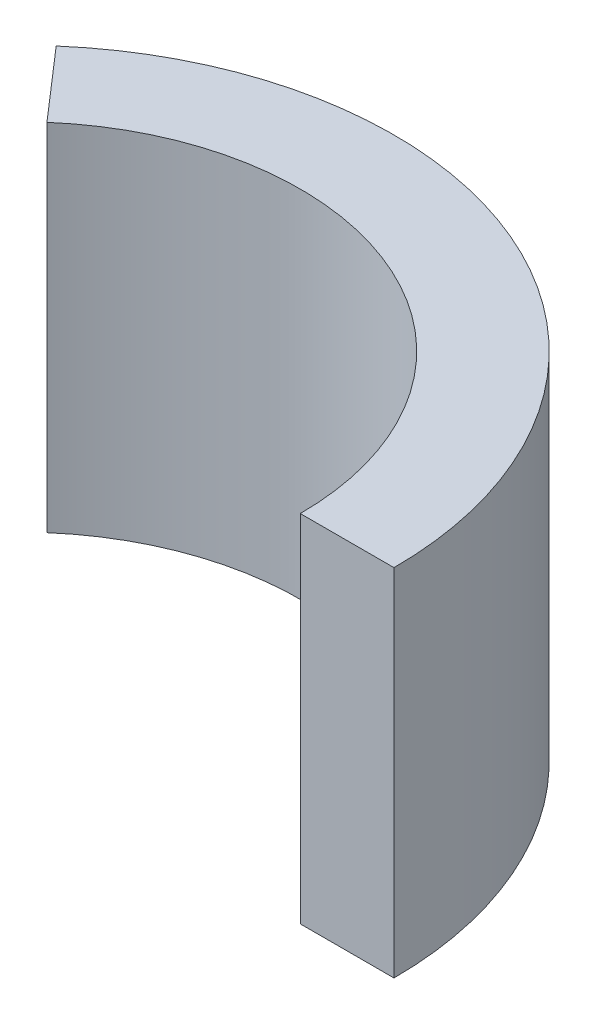
ISO-10303-21;
HEADER;
FILE_DESCRIPTION(('STEP AP214'),'2;1');
FILE_NAME('part.step','',(''),(''),'','','');
FILE_SCHEMA(('AUTOMOTIVE_DESIGN { 1 0 10303 214 1 1 1 1 }'));
ENDSEC;
DATA;
#1=APPLICATION_CONTEXT('core data for automotive mechanical design processes');
#2=APPLICATION_PROTOCOL_DEFINITION('international standard','automotive_design',2000,#1);
#3=PRODUCT_CONTEXT('',#1,'mechanical');
#4=PRODUCT('Part','Part','',(#3));
#5=PRODUCT_RELATED_PRODUCT_CATEGORY('part','',(#4));
#6=PRODUCT_DEFINITION_FORMATION('','',#4);
#7=PRODUCT_DEFINITION_CONTEXT('part definition',#1,'design');
#8=PRODUCT_DEFINITION('design','',#6,#7);
#9=PRODUCT_DEFINITION_SHAPE('','',#8);
#10=(LENGTH_UNIT() NAMED_UNIT(*) SI_UNIT(.MILLI.,.METRE.));
#11=(NAMED_UNIT(*) PLANE_ANGLE_UNIT() SI_UNIT($,.RADIAN.));
#12=(NAMED_UNIT(*) SI_UNIT($,.STERADIAN.) SOLID_ANGLE_UNIT());
#13=UNCERTAINTY_MEASURE_WITH_UNIT(LENGTH_MEASURE(1.E-05),#10,'distance_accuracy_value','');
#14=(GEOMETRIC_REPRESENTATION_CONTEXT(3) GLOBAL_UNCERTAINTY_ASSIGNED_CONTEXT((#13)) GLOBAL_UNIT_ASSIGNED_CONTEXT((#10,
#11,#12)) REPRESENTATION_CONTEXT('',''));
#15=CARTESIAN_POINT('',(0.,0.,0.));
#16=DIRECTION('',(0.,0.,1.));
#17=DIRECTION('',(1.,0.,0.));
#18=AXIS2_PLACEMENT_3D('',#15,#16,#17);
#19=CARTESIAN_POINT('',(4.,-13.,0.));
#20=DIRECTION('',(0.,-1.,0.));
#21=DIRECTION('',(0.,0.,-1.));
#22=AXIS2_PLACEMENT_3D('',#19,#20,#21);
#23=CYLINDRICAL_SURFACE('',#22,23.2);
#24=CARTESIAN_POINT('',(4.,-4.,0.));
#25=DIRECTION('',(0.,-1.,0.));
#26=DIRECTION('',(0.,0.,-1.));
#27=AXIS2_PLACEMENT_3D('',#24,#25,#26);
#28=CIRCLE('',#27,23.2);
#29=CARTESIAN_POINT('',(-11.2205694725798,-4.,-17.5092622611683));
#30=VERTEX_POINT('',#29);
#31=CARTESIAN_POINT('',(27.2,-4.,0.));
#32=VERTEX_POINT('',#31);
#33=EDGE_CURVE('E11',#30,#32,#28,.T.);
#34=ORIENTED_EDGE('',*,*,#33,.F.);
#35=DIRECTION('',(0.,1.,0.));
#36=VECTOR('',#35,1.);
#37=CARTESIAN_POINT('',(-11.2205694725798,-4.,-17.5092622611683));
#38=LINE('',#37,#36);
#39=CARTESIAN_POINT('',(-11.2205694725798,18.,-17.5092622611683));
#40=VERTEX_POINT('',#39);
#41=EDGE_CURVE('E87',#30,#40,#38,.T.);
#42=ORIENTED_EDGE('',*,*,#41,.T.);
#43=CARTESIAN_POINT('',(4.,18.,0.));
#44=DIRECTION('',(0.,-1.,0.));
#45=DIRECTION('',(0.,0.,-1.));
#46=AXIS2_PLACEMENT_3D('',#43,#44,#45);
#47=CIRCLE('',#46,23.2);
#48=CARTESIAN_POINT('',(27.2,18.,0.));
#49=VERTEX_POINT('',#48);
#50=EDGE_CURVE('E85',#40,#49,#47,.T.);
#51=ORIENTED_EDGE('',*,*,#50,.T.);
#52=DIRECTION('',(0.,1.,0.));
#53=VECTOR('',#52,1.);
#54=CARTESIAN_POINT('',(27.2,-4.,0.));
#55=LINE('',#54,#53);
#56=EDGE_CURVE('E84',#32,#49,#55,.T.);
#57=ORIENTED_EDGE('',*,*,#56,.F.);
#58=EDGE_LOOP('',(#34,#42,#51,#57));
#59=FACE_BOUND('',#58,.T.);
#60=ADVANCED_FACE('F44',(#59),#23,.T.);
#61=CARTESIAN_POINT('',(-11.2205694725798,-4.,-17.5092622611683));
#62=DIRECTION('',(0.,1.,0.));
#63=DIRECTION('',(0.,0.,1.));
#64=AXIS2_PLACEMENT_3D('',#61,#62,#63);
#65=PLANE('',#64);
#66=CARTESIAN_POINT('',(4.,-4.,0.));
#67=DIRECTION('',(0.,-1.,0.));
#68=DIRECTION('',(0.,0.,-1.));
#69=AXIS2_PLACEMENT_3D('',#66,#67,#68);
#70=CIRCLE('',#69,17.4);
#71=CARTESIAN_POINT('',(-7.41542710443482,-4.,-13.1319466958762));
#72=VERTEX_POINT('',#71);
#73=CARTESIAN_POINT('',(21.4,-4.,0.));
#74=VERTEX_POINT('',#73);
#75=EDGE_CURVE('E53',#72,#74,#70,.T.);
#76=ORIENTED_EDGE('',*,*,#75,.F.);
#77=DIRECTION('',(0.656059028990507,0.,0.754709580222772));
#78=VECTOR('',#77,1.);
#79=CARTESIAN_POINT('',(-11.2205694725798,-4.,-17.5092622611683));
#80=LINE('',#79,#78);
#81=EDGE_CURVE('E91',#30,#72,#80,.T.);
#82=ORIENTED_EDGE('',*,*,#81,.F.);
#83=ORIENTED_EDGE('',*,*,#33,.T.);
#84=DIRECTION('',(-1.,0.,0.));
#85=VECTOR('',#84,1.);
#86=CARTESIAN_POINT('',(27.2,-4.,0.));
#87=LINE('',#86,#85);
#88=EDGE_CURVE('E106',#32,#74,#87,.T.);
#89=ORIENTED_EDGE('',*,*,#88,.T.);
#90=EDGE_LOOP('',(#76,#82,#83,#89));
#91=FACE_BOUND('',#90,.T.);
#92=ADVANCED_FACE('F50',(#91),#65,.F.);
#93=CARTESIAN_POINT('',(4.,-13.,0.));
#94=DIRECTION('',(0.,-1.,0.));
#95=DIRECTION('',(0.,0.,-1.));
#96=AXIS2_PLACEMENT_3D('',#93,#94,#95);
#97=CYLINDRICAL_SURFACE('',#96,17.4);
#98=CARTESIAN_POINT('',(4.,18.,0.));
#99=DIRECTION('',(0.,-1.,0.));
#100=DIRECTION('',(0.,0.,-1.));
#101=AXIS2_PLACEMENT_3D('',#98,#99,#100);
#102=CIRCLE('',#101,17.4);
#103=CARTESIAN_POINT('',(-7.41542710443482,18.,-13.1319466958762));
#104=VERTEX_POINT('',#103);
#105=CARTESIAN_POINT('',(21.4,18.,0.));
#106=VERTEX_POINT('',#105);
#107=EDGE_CURVE('E95',#104,#106,#102,.T.);
#108=ORIENTED_EDGE('',*,*,#107,.F.);
#109=DIRECTION('',(0.,1.,0.));
#110=VECTOR('',#109,1.);
#111=CARTESIAN_POINT('',(-7.41542710443482,-4.,-13.1319466958762));
#112=LINE('',#111,#110);
#113=EDGE_CURVE('E116',#72,#104,#112,.T.);
#114=ORIENTED_EDGE('',*,*,#113,.F.);
#115=ORIENTED_EDGE('',*,*,#75,.T.);
#116=DIRECTION('',(0.,1.,0.));
#117=VECTOR('',#116,1.);
#118=CARTESIAN_POINT('',(21.4,-4.,0.));
#119=LINE('',#118,#117);
#120=EDGE_CURVE('E105',#74,#106,#119,.T.);
#121=ORIENTED_EDGE('',*,*,#120,.T.);
#122=EDGE_LOOP('',(#108,#114,#115,#121));
#123=FACE_BOUND('',#122,.T.);
#124=ADVANCED_FACE('F129',(#123),#97,.F.);
#125=CARTESIAN_POINT('',(-7.41542710443482,18.,-13.1319466958762));
#126=DIRECTION('',(0.,-1.,0.));
#127=DIRECTION('',(0.,0.,-1.));
#128=AXIS2_PLACEMENT_3D('',#125,#126,#127);
#129=PLANE('',#128);
#130=DIRECTION('',(-0.656059028990507,0.,-0.754709580222772));
#131=VECTOR('',#130,1.);
#132=CARTESIAN_POINT('',(-7.41542710443482,18.,-13.1319466958762));
#133=LINE('',#132,#131);
#134=EDGE_CURVE('E117',#104,#40,#133,.T.);
#135=ORIENTED_EDGE('',*,*,#134,.F.);
#136=ORIENTED_EDGE('',*,*,#107,.T.);
#137=DIRECTION('',(1.,0.,0.));
#138=VECTOR('',#137,1.);
#139=CARTESIAN_POINT('',(21.4,18.,0.));
#140=LINE('',#139,#138);
#141=EDGE_CURVE('E96',#106,#49,#140,.T.);
#142=ORIENTED_EDGE('',*,*,#141,.T.);
#143=ORIENTED_EDGE('',*,*,#50,.F.);
#144=EDGE_LOOP('',(#135,#136,#142,#143));
#145=FACE_BOUND('',#144,.T.);
#146=ADVANCED_FACE('F100',(#145),#129,.F.);
#147=CARTESIAN_POINT('',(6.62423611596203,0.,3.01883832089109));
#148=DIRECTION('',(-0.754709580222772,0.,0.656059028990507));
#149=DIRECTION('',(0.656059028990507,0.,0.754709580222772));
#150=AXIS2_PLACEMENT_3D('',#147,#148,#149);
#151=PLANE('',#150);
#152=ORIENTED_EDGE('',*,*,#41,.F.);
#153=ORIENTED_EDGE('',*,*,#81,.T.);
#154=ORIENTED_EDGE('',*,*,#113,.T.);
#155=ORIENTED_EDGE('',*,*,#134,.T.);
#156=EDGE_LOOP('',(#152,#153,#154,#155));
#157=FACE_BOUND('',#156,.T.);
#158=ADVANCED_FACE('F132',(#157),#151,.T.);
#159=CARTESIAN_POINT('',(0.,0.,0.));
#160=DIRECTION('',(0.,0.,-1.));
#161=DIRECTION('',(-1.,0.,0.));
#162=AXIS2_PLACEMENT_3D('',#159,#160,#161);
#163=PLANE('',#162);
#164=ORIENTED_EDGE('',*,*,#56,.T.);
#165=ORIENTED_EDGE('',*,*,#141,.F.);
#166=ORIENTED_EDGE('',*,*,#120,.F.);
#167=ORIENTED_EDGE('',*,*,#88,.F.);
#168=EDGE_LOOP('',(#164,#165,#166,#167));
#169=FACE_BOUND('',#168,.T.);
#170=ADVANCED_FACE('F104',(#169),#163,.F.);
#171=CLOSED_SHELL('',(#60,#92,#124,#146,#158,#170));
#172=MANIFOLD_SOLID_BREP('B2',#171);
#173=ADVANCED_BREP_SHAPE_REPRESENTATION('',(#18,#172),#14);
#174=SHAPE_DEFINITION_REPRESENTATION(#9,#173);
ENDSEC;
END-ISO-10303-21;
